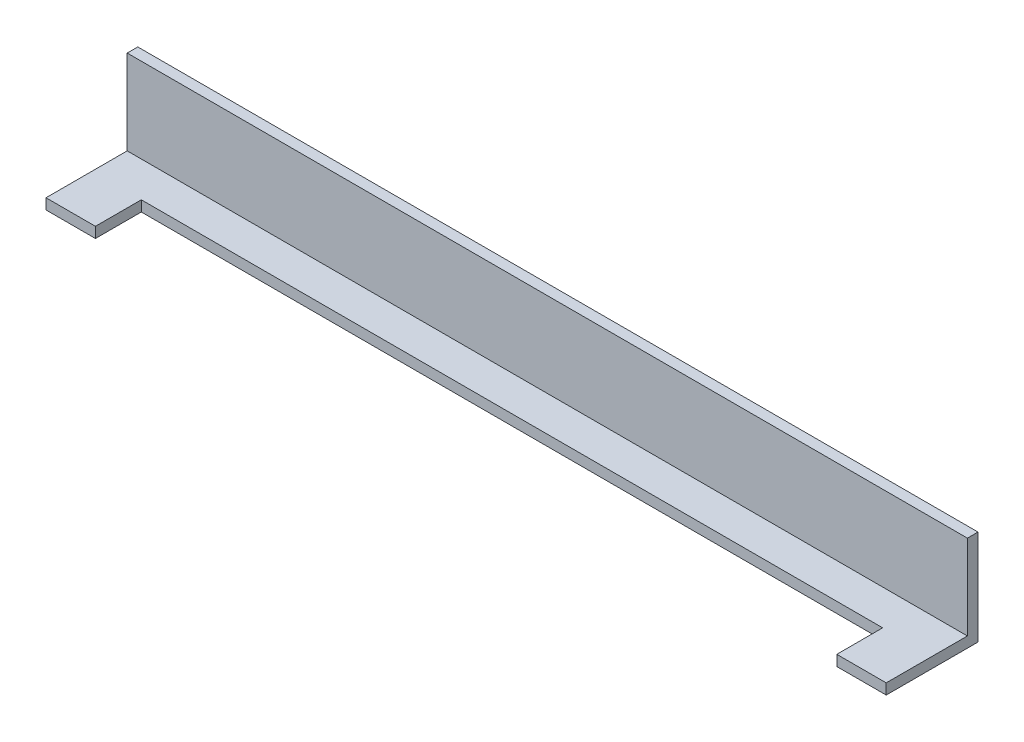
ISO-10303-21;
HEADER;
FILE_DESCRIPTION(('STEP AP214'),'2;1');
FILE_NAME('part.step','',(''),(''),'','','');
FILE_SCHEMA(('AUTOMOTIVE_DESIGN { 1 0 10303 214 1 1 1 1 }'));
ENDSEC;
DATA;
#1=APPLICATION_CONTEXT('core data for automotive mechanical design processes');
#2=APPLICATION_PROTOCOL_DEFINITION('international standard','automotive_design',2000,#1);
#3=PRODUCT_CONTEXT('',#1,'mechanical');
#4=PRODUCT('Part','Part','',(#3));
#5=PRODUCT_RELATED_PRODUCT_CATEGORY('part','',(#4));
#6=PRODUCT_DEFINITION_FORMATION('','',#4);
#7=PRODUCT_DEFINITION_CONTEXT('part definition',#1,'design');
#8=PRODUCT_DEFINITION('design','',#6,#7);
#9=PRODUCT_DEFINITION_SHAPE('','',#8);
#10=(LENGTH_UNIT() NAMED_UNIT(*) SI_UNIT(.MILLI.,.METRE.));
#11=(NAMED_UNIT(*) PLANE_ANGLE_UNIT() SI_UNIT($,.RADIAN.));
#12=(NAMED_UNIT(*) SI_UNIT($,.STERADIAN.) SOLID_ANGLE_UNIT());
#13=UNCERTAINTY_MEASURE_WITH_UNIT(LENGTH_MEASURE(1.E-05),#10,'distance_accuracy_value','');
#14=(GEOMETRIC_REPRESENTATION_CONTEXT(3) GLOBAL_UNCERTAINTY_ASSIGNED_CONTEXT((#13)) GLOBAL_UNIT_ASSIGNED_CONTEXT((#10,
#11,#12)) REPRESENTATION_CONTEXT('',''));
#15=CARTESIAN_POINT('',(0.,0.,0.));
#16=DIRECTION('',(0.,0.,1.));
#17=DIRECTION('',(1.,0.,0.));
#18=AXIS2_PLACEMENT_3D('',#15,#16,#17);
#19=CARTESIAN_POINT('',(0.,3.,0.));
#20=DIRECTION('',(0.,-1.,0.));
#21=DIRECTION('',(0.,0.,-1.));
#22=AXIS2_PLACEMENT_3D('',#19,#20,#21);
#23=PLANE('',#22);
#24=DIRECTION('',(0.,0.,-1.));
#25=VECTOR('',#24,1.);
#26=CARTESIAN_POINT('',(0.,3.,0.));
#27=LINE('',#26,#25);
#28=CARTESIAN_POINT('',(0.,3.,26.));
#29=VERTEX_POINT('',#28);
#30=CARTESIAN_POINT('',(0.,3.,3.));
#31=VERTEX_POINT('',#30);
#32=EDGE_CURVE('E213',#29,#31,#27,.T.);
#33=ORIENTED_EDGE('',*,*,#32,.T.);
#34=DIRECTION('',(1.,0.,0.));
#35=VECTOR('',#34,1.);
#36=CARTESIAN_POINT('',(0.,3.,3.));
#37=LINE('',#36,#35);
#38=CARTESIAN_POINT('',(-238.,3.,3.00000000000001));
#39=VERTEX_POINT('',#38);
#40=EDGE_CURVE('E187',#39,#31,#37,.T.);
#41=ORIENTED_EDGE('',*,*,#40,.F.);
#42=DIRECTION('',(0.,0.,1.));
#43=VECTOR('',#42,1.);
#44=CARTESIAN_POINT('',(-238.,3.,0.));
#45=LINE('',#44,#43);
#46=CARTESIAN_POINT('',(-238.,3.,26.));
#47=VERTEX_POINT('',#46);
#48=EDGE_CURVE('E217',#39,#47,#45,.T.);
#49=ORIENTED_EDGE('',*,*,#48,.T.);
#50=DIRECTION('',(1.,0.,0.));
#51=VECTOR('',#50,1.);
#52=CARTESIAN_POINT('',(-238.,3.,26.));
#53=LINE('',#52,#51);
#54=CARTESIAN_POINT('',(-224.,3.,26.));
#55=VERTEX_POINT('',#54);
#56=EDGE_CURVE('E138',#47,#55,#53,.T.);
#57=ORIENTED_EDGE('',*,*,#56,.T.);
#58=DIRECTION('',(0.,0.,-1.));
#59=VECTOR('',#58,1.);
#60=CARTESIAN_POINT('',(-224.,3.,3.00000000000001));
#61=LINE('',#60,#59);
#62=CARTESIAN_POINT('',(-224.,3.,13.));
#63=VERTEX_POINT('',#62);
#64=EDGE_CURVE('E57',#55,#63,#61,.T.);
#65=ORIENTED_EDGE('',*,*,#64,.T.);
#66=DIRECTION('',(1.,0.,0.));
#67=VECTOR('',#66,1.);
#68=CARTESIAN_POINT('',(0.,3.,13.));
#69=LINE('',#68,#67);
#70=CARTESIAN_POINT('',(-14.,3.,13.));
#71=VERTEX_POINT('',#70);
#72=EDGE_CURVE('E62',#63,#71,#69,.T.);
#73=ORIENTED_EDGE('',*,*,#72,.T.);
#74=DIRECTION('',(0.,0.,-1.));
#75=VECTOR('',#74,1.);
#76=CARTESIAN_POINT('',(-14.,3.,0.));
#77=LINE('',#76,#75);
#78=CARTESIAN_POINT('',(-14.,3.,26.));
#79=VERTEX_POINT('',#78);
#80=EDGE_CURVE('E166',#79,#71,#77,.T.);
#81=ORIENTED_EDGE('',*,*,#80,.F.);
#82=DIRECTION('',(-1.,0.,0.));
#83=VECTOR('',#82,1.);
#84=CARTESIAN_POINT('',(0.,3.,26.));
#85=LINE('',#84,#83);
#86=EDGE_CURVE('E162',#29,#79,#85,.T.);
#87=ORIENTED_EDGE('',*,*,#86,.F.);
#88=EDGE_LOOP('',(#33,#41,#49,#57,#65,#73,#81,#87));
#89=FACE_BOUND('',#88,.T.);
#90=ADVANCED_FACE('F41',(#89),#23,.F.);
#91=CARTESIAN_POINT('',(0.,3.,0.));
#92=DIRECTION('',(-1.,0.,0.));
#93=DIRECTION('',(0.,0.,1.));
#94=AXIS2_PLACEMENT_3D('',#91,#92,#93);
#95=PLANE('',#94);
#96=DIRECTION('',(0.,0.,-1.));
#97=VECTOR('',#96,1.);
#98=CARTESIAN_POINT('',(0.,0.,0.));
#99=LINE('',#98,#97);
#100=CARTESIAN_POINT('',(0.,0.,26.));
#101=VERTEX_POINT('',#100);
#102=CARTESIAN_POINT('',(0.,0.,0.));
#103=VERTEX_POINT('',#102);
#104=EDGE_CURVE('E212',#101,#103,#99,.T.);
#105=ORIENTED_EDGE('',*,*,#104,.T.);
#106=DIRECTION('',(0.,-1.,0.));
#107=VECTOR('',#106,1.);
#108=CARTESIAN_POINT('',(0.,3.,0.));
#109=LINE('',#108,#107);
#110=CARTESIAN_POINT('',(0.,27.,0.));
#111=VERTEX_POINT('',#110);
#112=EDGE_CURVE('E11',#111,#103,#109,.T.);
#113=ORIENTED_EDGE('',*,*,#112,.F.);
#114=DIRECTION('',(0.,0.,-1.));
#115=VECTOR('',#114,1.);
#116=CARTESIAN_POINT('',(0.,27.,0.));
#117=LINE('',#116,#115);
#118=CARTESIAN_POINT('',(0.,27.,3.));
#119=VERTEX_POINT('',#118);
#120=EDGE_CURVE('E188',#119,#111,#117,.T.);
#121=ORIENTED_EDGE('',*,*,#120,.F.);
#122=DIRECTION('',(0.,-1.,0.));
#123=VECTOR('',#122,1.);
#124=CARTESIAN_POINT('',(0.,27.,3.));
#125=LINE('',#124,#123);
#126=EDGE_CURVE('E202',#119,#31,#125,.T.);
#127=ORIENTED_EDGE('',*,*,#126,.T.);
#128=ORIENTED_EDGE('',*,*,#32,.F.);
#129=DIRECTION('',(0.,-1.,0.));
#130=VECTOR('',#129,1.);
#131=CARTESIAN_POINT('',(0.,3.,26.));
#132=LINE('',#131,#130);
#133=EDGE_CURVE('E171',#29,#101,#132,.T.);
#134=ORIENTED_EDGE('',*,*,#133,.T.);
#135=EDGE_LOOP('',(#105,#113,#121,#127,#128,#134));
#136=FACE_BOUND('',#135,.T.);
#137=ADVANCED_FACE('F43',(#136),#95,.F.);
#138=CARTESIAN_POINT('',(0.,3.,0.));
#139=DIRECTION('',(0.,0.,1.));
#140=DIRECTION('',(1.,0.,0.));
#141=AXIS2_PLACEMENT_3D('',#138,#139,#140);
#142=PLANE('',#141);
#143=DIRECTION('',(-1.,0.,0.));
#144=VECTOR('',#143,1.);
#145=CARTESIAN_POINT('',(0.,0.,0.));
#146=LINE('',#145,#144);
#147=CARTESIAN_POINT('',(-238.,0.,0.));
#148=VERTEX_POINT('',#147);
#149=EDGE_CURVE('E132',#103,#148,#146,.T.);
#150=ORIENTED_EDGE('',*,*,#149,.T.);
#151=DIRECTION('',(0.,-1.,0.));
#152=VECTOR('',#151,1.);
#153=CARTESIAN_POINT('',(-238.,3.,0.));
#154=LINE('',#153,#152);
#155=CARTESIAN_POINT('',(-238.,27.,0.));
#156=VERTEX_POINT('',#155);
#157=EDGE_CURVE('E50',#156,#148,#154,.T.);
#158=ORIENTED_EDGE('',*,*,#157,.F.);
#159=DIRECTION('',(-1.,0.,0.));
#160=VECTOR('',#159,1.);
#161=CARTESIAN_POINT('',(0.,27.,0.));
#162=LINE('',#161,#160);
#163=EDGE_CURVE('E192',#111,#156,#162,.T.);
#164=ORIENTED_EDGE('',*,*,#163,.F.);
#165=ORIENTED_EDGE('',*,*,#112,.T.);
#166=EDGE_LOOP('',(#150,#158,#164,#165));
#167=FACE_BOUND('',#166,.T.);
#168=ADVANCED_FACE('F251',(#167),#142,.F.);
#169=CARTESIAN_POINT('',(-238.,3.,0.));
#170=DIRECTION('',(1.,0.,0.));
#171=DIRECTION('',(0.,0.,-1.));
#172=AXIS2_PLACEMENT_3D('',#169,#170,#171);
#173=PLANE('',#172);
#174=DIRECTION('',(0.,0.,1.));
#175=VECTOR('',#174,1.);
#176=CARTESIAN_POINT('',(-238.,0.,0.));
#177=LINE('',#176,#175);
#178=CARTESIAN_POINT('',(-238.,0.,26.));
#179=VERTEX_POINT('',#178);
#180=EDGE_CURVE('E120',#148,#179,#177,.T.);
#181=ORIENTED_EDGE('',*,*,#180,.T.);
#182=DIRECTION('',(0.,1.,0.));
#183=VECTOR('',#182,1.);
#184=CARTESIAN_POINT('',(-238.,0.,26.));
#185=LINE('',#184,#183);
#186=EDGE_CURVE('E124',#179,#47,#185,.T.);
#187=ORIENTED_EDGE('',*,*,#186,.T.);
#188=ORIENTED_EDGE('',*,*,#48,.F.);
#189=DIRECTION('',(0.,-1.,0.));
#190=VECTOR('',#189,1.);
#191=CARTESIAN_POINT('',(-238.,27.,3.00000000000003));
#192=LINE('',#191,#190);
#193=CARTESIAN_POINT('',(-238.,27.,3.00000000000003));
#194=VERTEX_POINT('',#193);
#195=EDGE_CURVE('E208',#194,#39,#192,.T.);
#196=ORIENTED_EDGE('',*,*,#195,.F.);
#197=DIRECTION('',(0.,0.,1.));
#198=VECTOR('',#197,1.);
#199=CARTESIAN_POINT('',(-238.,27.,0.));
#200=LINE('',#199,#198);
#201=EDGE_CURVE('E196',#156,#194,#200,.T.);
#202=ORIENTED_EDGE('',*,*,#201,.F.);
#203=ORIENTED_EDGE('',*,*,#157,.T.);
#204=EDGE_LOOP('',(#181,#187,#188,#196,#202,#203));
#205=FACE_BOUND('',#204,.T.);
#206=ADVANCED_FACE('F122',(#205),#173,.F.);
#207=CARTESIAN_POINT('',(0.,3.,13.));
#208=DIRECTION('',(0.,0.,-1.));
#209=DIRECTION('',(-1.,0.,0.));
#210=AXIS2_PLACEMENT_3D('',#207,#208,#209);
#211=PLANE('',#210);
#212=ORIENTED_EDGE('',*,*,#72,.F.);
#213=DIRECTION('',(0.,-1.,0.));
#214=VECTOR('',#213,1.);
#215=CARTESIAN_POINT('',(-224.,3.,13.));
#216=LINE('',#215,#214);
#217=CARTESIAN_POINT('',(-224.,0.,13.));
#218=VERTEX_POINT('',#217);
#219=EDGE_CURVE('E156',#63,#218,#216,.T.);
#220=ORIENTED_EDGE('',*,*,#219,.T.);
#221=DIRECTION('',(1.,0.,0.));
#222=VECTOR('',#221,1.);
#223=CARTESIAN_POINT('',(0.,0.,13.));
#224=LINE('',#223,#222);
#225=CARTESIAN_POINT('',(-14.,0.,13.));
#226=VERTEX_POINT('',#225);
#227=EDGE_CURVE('E131',#218,#226,#224,.T.);
#228=ORIENTED_EDGE('',*,*,#227,.T.);
#229=DIRECTION('',(0.,1.,0.));
#230=VECTOR('',#229,1.);
#231=CARTESIAN_POINT('',(-14.,3.,13.));
#232=LINE('',#231,#230);
#233=EDGE_CURVE('E181',#226,#71,#232,.T.);
#234=ORIENTED_EDGE('',*,*,#233,.T.);
#235=EDGE_LOOP('',(#212,#220,#228,#234));
#236=FACE_BOUND('',#235,.T.);
#237=ADVANCED_FACE('F231',(#236),#211,.F.);
#238=CARTESIAN_POINT('',(0.,0.,0.));
#239=DIRECTION('',(0.,-1.,0.));
#240=DIRECTION('',(0.,0.,-1.));
#241=AXIS2_PLACEMENT_3D('',#238,#239,#240);
#242=PLANE('',#241);
#243=DIRECTION('',(1.,0.,0.));
#244=VECTOR('',#243,1.);
#245=CARTESIAN_POINT('',(-238.,0.,26.));
#246=LINE('',#245,#244);
#247=CARTESIAN_POINT('',(-224.,0.,26.));
#248=VERTEX_POINT('',#247);
#249=EDGE_CURVE('E137',#179,#248,#246,.T.);
#250=ORIENTED_EDGE('',*,*,#249,.F.);
#251=ORIENTED_EDGE('',*,*,#180,.F.);
#252=ORIENTED_EDGE('',*,*,#149,.F.);
#253=ORIENTED_EDGE('',*,*,#104,.F.);
#254=DIRECTION('',(-1.,0.,0.));
#255=VECTOR('',#254,1.);
#256=CARTESIAN_POINT('',(0.,0.,26.));
#257=LINE('',#256,#255);
#258=CARTESIAN_POINT('',(-14.,0.,26.));
#259=VERTEX_POINT('',#258);
#260=EDGE_CURVE('E161',#101,#259,#257,.T.);
#261=ORIENTED_EDGE('',*,*,#260,.T.);
#262=DIRECTION('',(0.,0.,-1.));
#263=VECTOR('',#262,1.);
#264=CARTESIAN_POINT('',(-14.,0.,0.));
#265=LINE('',#264,#263);
#266=EDGE_CURVE('E167',#259,#226,#265,.T.);
#267=ORIENTED_EDGE('',*,*,#266,.T.);
#268=ORIENTED_EDGE('',*,*,#227,.F.);
#269=DIRECTION('',(0.,0.,-1.));
#270=VECTOR('',#269,1.);
#271=CARTESIAN_POINT('',(-224.,0.,3.00000000000001));
#272=LINE('',#271,#270);
#273=EDGE_CURVE('E141',#248,#218,#272,.T.);
#274=ORIENTED_EDGE('',*,*,#273,.F.);
#275=EDGE_LOOP('',(#250,#251,#252,#253,#261,#267,#268,#274));
#276=FACE_BOUND('',#275,.T.);
#277=ADVANCED_FACE('F144',(#276),#242,.T.);
#278=CARTESIAN_POINT('',(0.,27.,3.));
#279=DIRECTION('',(0.,0.,-1.));
#280=DIRECTION('',(-1.,0.,0.));
#281=AXIS2_PLACEMENT_3D('',#278,#279,#280);
#282=PLANE('',#281);
#283=ORIENTED_EDGE('',*,*,#40,.T.);
#284=ORIENTED_EDGE('',*,*,#126,.F.);
#285=DIRECTION('',(1.,0.,0.));
#286=VECTOR('',#285,1.);
#287=CARTESIAN_POINT('',(0.,27.,3.));
#288=LINE('',#287,#286);
#289=EDGE_CURVE('E199',#194,#119,#288,.T.);
#290=ORIENTED_EDGE('',*,*,#289,.F.);
#291=ORIENTED_EDGE('',*,*,#195,.T.);
#292=EDGE_LOOP('',(#283,#284,#290,#291));
#293=FACE_BOUND('',#292,.T.);
#294=ADVANCED_FACE('F245',(#293),#282,.F.);
#295=CARTESIAN_POINT('',(0.,27.,0.));
#296=DIRECTION('',(0.,-1.,0.));
#297=DIRECTION('',(0.,0.,-1.));
#298=AXIS2_PLACEMENT_3D('',#295,#296,#297);
#299=PLANE('',#298);
#300=ORIENTED_EDGE('',*,*,#120,.T.);
#301=ORIENTED_EDGE('',*,*,#163,.T.);
#302=ORIENTED_EDGE('',*,*,#201,.T.);
#303=ORIENTED_EDGE('',*,*,#289,.T.);
#304=EDGE_LOOP('',(#300,#301,#302,#303));
#305=FACE_BOUND('',#304,.T.);
#306=ADVANCED_FACE('F248',(#305),#299,.F.);
#307=CARTESIAN_POINT('',(-14.,3.,0.));
#308=DIRECTION('',(-1.,0.,0.));
#309=DIRECTION('',(0.,0.,1.));
#310=AXIS2_PLACEMENT_3D('',#307,#308,#309);
#311=PLANE('',#310);
#312=ORIENTED_EDGE('',*,*,#233,.F.);
#313=ORIENTED_EDGE('',*,*,#266,.F.);
#314=DIRECTION('',(0.,-1.,0.));
#315=VECTOR('',#314,1.);
#316=CARTESIAN_POINT('',(-14.,3.,26.));
#317=LINE('',#316,#315);
#318=EDGE_CURVE('E178',#79,#259,#317,.T.);
#319=ORIENTED_EDGE('',*,*,#318,.F.);
#320=ORIENTED_EDGE('',*,*,#80,.T.);
#321=EDGE_LOOP('',(#312,#313,#319,#320));
#322=FACE_BOUND('',#321,.T.);
#323=ADVANCED_FACE('F234',(#322),#311,.T.);
#324=CARTESIAN_POINT('',(0.,3.,26.));
#325=DIRECTION('',(0.,0.,1.));
#326=DIRECTION('',(1.,0.,0.));
#327=AXIS2_PLACEMENT_3D('',#324,#325,#326);
#328=PLANE('',#327);
#329=ORIENTED_EDGE('',*,*,#260,.F.);
#330=ORIENTED_EDGE('',*,*,#133,.F.);
#331=ORIENTED_EDGE('',*,*,#86,.T.);
#332=ORIENTED_EDGE('',*,*,#318,.T.);
#333=EDGE_LOOP('',(#329,#330,#331,#332));
#334=FACE_BOUND('',#333,.T.);
#335=ADVANCED_FACE('F238',(#334),#328,.T.);
#336=CARTESIAN_POINT('',(-224.,0.,3.00000000000001));
#337=DIRECTION('',(1.,0.,0.));
#338=DIRECTION('',(0.,0.,-1.));
#339=AXIS2_PLACEMENT_3D('',#336,#337,#338);
#340=PLANE('',#339);
#341=ORIENTED_EDGE('',*,*,#219,.F.);
#342=ORIENTED_EDGE('',*,*,#64,.F.);
#343=DIRECTION('',(0.,1.,0.));
#344=VECTOR('',#343,1.);
#345=CARTESIAN_POINT('',(-224.,0.,26.));
#346=LINE('',#345,#344);
#347=EDGE_CURVE('E140',#248,#55,#346,.T.);
#348=ORIENTED_EDGE('',*,*,#347,.F.);
#349=ORIENTED_EDGE('',*,*,#273,.T.);
#350=EDGE_LOOP('',(#341,#342,#348,#349));
#351=FACE_BOUND('',#350,.T.);
#352=ADVANCED_FACE('F300',(#351),#340,.T.);
#353=CARTESIAN_POINT('',(-238.,0.,26.));
#354=DIRECTION('',(0.,0.,1.));
#355=DIRECTION('',(1.,0.,0.));
#356=AXIS2_PLACEMENT_3D('',#353,#354,#355);
#357=PLANE('',#356);
#358=ORIENTED_EDGE('',*,*,#56,.F.);
#359=ORIENTED_EDGE('',*,*,#186,.F.);
#360=ORIENTED_EDGE('',*,*,#249,.T.);
#361=ORIENTED_EDGE('',*,*,#347,.T.);
#362=EDGE_LOOP('',(#358,#359,#360,#361));
#363=FACE_BOUND('',#362,.T.);
#364=ADVANCED_FACE('F136',(#363),#357,.T.);
#365=CLOSED_SHELL('',(#90,#137,#168,#206,#237,#277,#294,#306,#323,#335,#352,#364));
#366=MANIFOLD_SOLID_BREP('B2',#365);
#367=ADVANCED_BREP_SHAPE_REPRESENTATION('',(#18,#366),#14);
#368=SHAPE_DEFINITION_REPRESENTATION(#9,#367);
ENDSEC;
END-ISO-10303-21;
